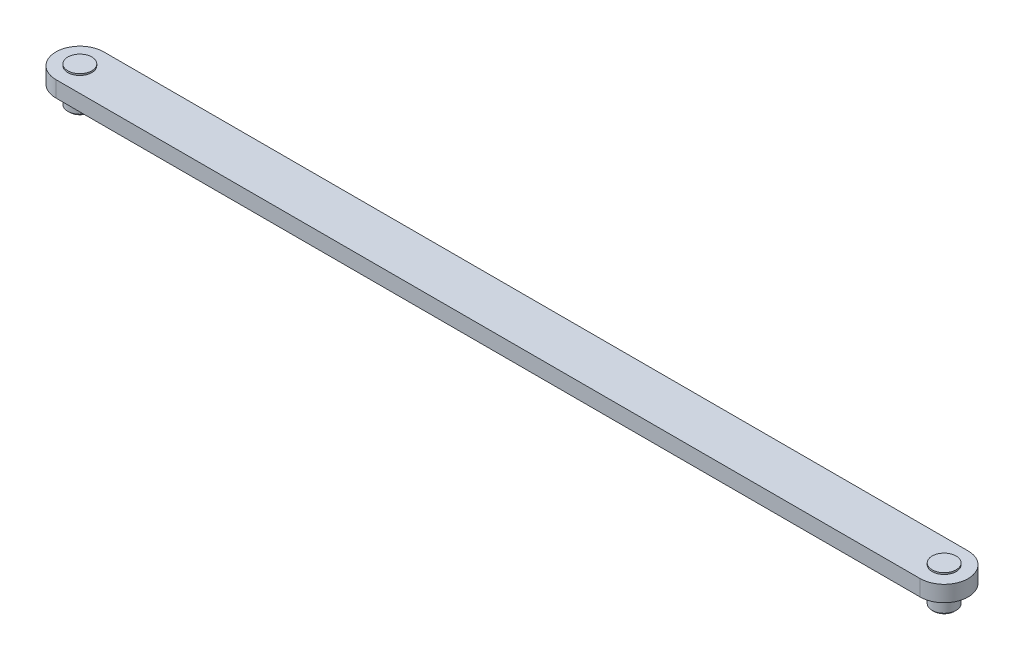
ISO-10303-21;
HEADER;
FILE_DESCRIPTION(('STEP AP214'),'2;1');
FILE_NAME('part.step','',(''),(''),'','','');
FILE_SCHEMA(('AUTOMOTIVE_DESIGN { 1 0 10303 214 1 1 1 1 }'));
ENDSEC;
DATA;
#1=APPLICATION_CONTEXT('core data for automotive mechanical design processes');
#2=APPLICATION_PROTOCOL_DEFINITION('international standard','automotive_design',2000,#1);
#3=PRODUCT_CONTEXT('',#1,'mechanical');
#4=PRODUCT('Part','Part','',(#3));
#5=PRODUCT_RELATED_PRODUCT_CATEGORY('part','',(#4));
#6=PRODUCT_DEFINITION_FORMATION('','',#4);
#7=PRODUCT_DEFINITION_CONTEXT('part definition',#1,'design');
#8=PRODUCT_DEFINITION('design','',#6,#7);
#9=PRODUCT_DEFINITION_SHAPE('','',#8);
#10=(LENGTH_UNIT() NAMED_UNIT(*) SI_UNIT(.MILLI.,.METRE.));
#11=(NAMED_UNIT(*) PLANE_ANGLE_UNIT() SI_UNIT($,.RADIAN.));
#12=(NAMED_UNIT(*) SI_UNIT($,.STERADIAN.) SOLID_ANGLE_UNIT());
#13=UNCERTAINTY_MEASURE_WITH_UNIT(LENGTH_MEASURE(1.E-05),#10,'distance_accuracy_value','');
#14=(GEOMETRIC_REPRESENTATION_CONTEXT(3) GLOBAL_UNCERTAINTY_ASSIGNED_CONTEXT((#13)) GLOBAL_UNIT_ASSIGNED_CONTEXT((#10,
#11,#12)) REPRESENTATION_CONTEXT('',''));
#15=CARTESIAN_POINT('',(0.,0.,0.));
#16=DIRECTION('',(0.,0.,1.));
#17=DIRECTION('',(1.,0.,0.));
#18=AXIS2_PLACEMENT_3D('',#15,#16,#17);
#19=CARTESIAN_POINT('',(-141.647927202037,5.,-139.020874391124));
#20=DIRECTION('',(0.,1.,0.));
#21=DIRECTION('',(0.,0.,1.));
#22=AXIS2_PLACEMENT_3D('',#19,#20,#21);
#23=PLANE('',#22);
#24=CARTESIAN_POINT('',(-141.647927202037,5.,-139.020874391124));
#25=DIRECTION('',(0.,1.,0.));
#26=DIRECTION('',(0.,0.,1.));
#27=AXIS2_PLACEMENT_3D('',#24,#25,#26);
#28=CIRCLE('',#27,7.50000000000001);
#29=CARTESIAN_POINT('',(-141.647927202037,5.,-131.520874391124));
#30=VERTEX_POINT('',#29);
#31=EDGE_CURVE('E112',#30,#30,#28,.T.);
#32=ORIENTED_EDGE('',*,*,#31,.F.);
#33=EDGE_LOOP('',(#32));
#34=FACE_BOUND('',#33,.T.);
#35=CARTESIAN_POINT('',(-141.647927202037,5.,-139.020874391124));
#36=DIRECTION('',(0.,1.,0.));
#37=DIRECTION('',(0.,0.,1.));
#38=AXIS2_PLACEMENT_3D('',#35,#36,#37);
#39=CIRCLE('',#38,15.);
#40=CARTESIAN_POINT('',(-141.647927202037,5.,-154.020874391124));
#41=VERTEX_POINT('',#40);
#42=CARTESIAN_POINT('',(-141.647927202037,5.,-124.020874391124));
#43=VERTEX_POINT('',#42);
#44=EDGE_CURVE('E94',#41,#43,#39,.T.);
#45=ORIENTED_EDGE('',*,*,#44,.T.);
#46=DIRECTION('',(1.,0.,0.));
#47=VECTOR('',#46,1.);
#48=CARTESIAN_POINT('',(-141.647927202037,5.,-124.020874391124));
#49=LINE('',#48,#47);
#50=CARTESIAN_POINT('',(399.122072797963,5.,-124.020874391124));
#51=VERTEX_POINT('',#50);
#52=EDGE_CURVE('E89',#43,#51,#49,.T.);
#53=ORIENTED_EDGE('',*,*,#52,.T.);
#54=CARTESIAN_POINT('',(399.122072797963,5.,-139.020874391124));
#55=DIRECTION('',(0.,1.,0.));
#56=DIRECTION('',(0.,0.,1.));
#57=AXIS2_PLACEMENT_3D('',#54,#55,#56);
#58=CIRCLE('',#57,15.);
#59=CARTESIAN_POINT('',(399.122072797963,5.,-154.020874391124));
#60=VERTEX_POINT('',#59);
#61=EDGE_CURVE('E92',#51,#60,#58,.T.);
#62=ORIENTED_EDGE('',*,*,#61,.T.);
#63=DIRECTION('',(-1.,0.,0.));
#64=VECTOR('',#63,1.);
#65=CARTESIAN_POINT('',(-141.647927202037,5.,-154.020874391124));
#66=LINE('',#65,#64);
#67=EDGE_CURVE('E58',#60,#41,#66,.T.);
#68=ORIENTED_EDGE('',*,*,#67,.T.);
#69=EDGE_LOOP('',(#45,#53,#62,#68));
#70=FACE_BOUND('',#69,.T.);
#71=CARTESIAN_POINT('',(399.122072797963,5.,-139.020874391124));
#72=DIRECTION('',(0.,1.,0.));
#73=DIRECTION('',(0.,0.,1.));
#74=AXIS2_PLACEMENT_3D('',#71,#72,#73);
#75=CIRCLE('',#74,7.50000000000001);
#76=CARTESIAN_POINT('',(399.122072797963,5.,-131.520874391124));
#77=VERTEX_POINT('',#76);
#78=EDGE_CURVE('E200',#77,#77,#75,.T.);
#79=ORIENTED_EDGE('',*,*,#78,.F.);
#80=EDGE_LOOP('',(#79));
#81=FACE_BOUND('',#80,.T.);
#82=ADVANCED_FACE('F40',(#34,#70,#81),#23,.T.);
#83=CARTESIAN_POINT('',(-141.647927202037,-5.,-139.020874391124));
#84=DIRECTION('',(0.,1.,0.));
#85=DIRECTION('',(0.,0.,1.));
#86=AXIS2_PLACEMENT_3D('',#83,#84,#85);
#87=PLANE('',#86);
#88=CARTESIAN_POINT('',(-141.647927202037,-5.,-139.020874391124));
#89=DIRECTION('',(0.,1.,0.));
#90=DIRECTION('',(0.,0.,1.));
#91=AXIS2_PLACEMENT_3D('',#88,#89,#90);
#92=CIRCLE('',#91,15.);
#93=CARTESIAN_POINT('',(-141.647927202037,-5.,-154.020874391124));
#94=VERTEX_POINT('',#93);
#95=CARTESIAN_POINT('',(-141.647927202037,-5.,-124.020874391124));
#96=VERTEX_POINT('',#95);
#97=EDGE_CURVE('E109',#94,#96,#92,.T.);
#98=ORIENTED_EDGE('',*,*,#97,.F.);
#99=DIRECTION('',(-1.,0.,0.));
#100=VECTOR('',#99,1.);
#101=CARTESIAN_POINT('',(-141.647927202037,-5.,-154.020874391124));
#102=LINE('',#101,#100);
#103=CARTESIAN_POINT('',(399.122072797963,-5.,-154.020874391124));
#104=VERTEX_POINT('',#103);
#105=EDGE_CURVE('E81',#104,#94,#102,.T.);
#106=ORIENTED_EDGE('',*,*,#105,.F.);
#107=CARTESIAN_POINT('',(399.122072797963,-5.,-139.020874391124));
#108=DIRECTION('',(0.,1.,0.));
#109=DIRECTION('',(0.,0.,1.));
#110=AXIS2_PLACEMENT_3D('',#107,#108,#109);
#111=CIRCLE('',#110,15.);
#112=CARTESIAN_POINT('',(399.122072797963,-5.,-124.020874391124));
#113=VERTEX_POINT('',#112);
#114=EDGE_CURVE('E75',#113,#104,#111,.T.);
#115=ORIENTED_EDGE('',*,*,#114,.F.);
#116=DIRECTION('',(1.,0.,0.));
#117=VECTOR('',#116,1.);
#118=CARTESIAN_POINT('',(-141.647927202037,-5.,-124.020874391124));
#119=LINE('',#118,#117);
#120=EDGE_CURVE('E99',#96,#113,#119,.T.);
#121=ORIENTED_EDGE('',*,*,#120,.F.);
#122=EDGE_LOOP('',(#98,#106,#115,#121));
#123=FACE_BOUND('',#122,.T.);
#124=CARTESIAN_POINT('',(-141.647927202037,-5.,-139.020874391124));
#125=DIRECTION('',(0.,1.,0.));
#126=DIRECTION('',(0.,0.,1.));
#127=AXIS2_PLACEMENT_3D('',#124,#125,#126);
#128=CIRCLE('',#127,7.50000000000001);
#129=CARTESIAN_POINT('',(-141.647927202037,-5.,-131.520874391124));
#130=VERTEX_POINT('',#129);
#131=EDGE_CURVE('E212',#130,#130,#128,.F.);
#132=ORIENTED_EDGE('',*,*,#131,.F.);
#133=EDGE_LOOP('',(#132));
#134=FACE_BOUND('',#133,.T.);
#135=CARTESIAN_POINT('',(399.122072797963,-5.,-139.020874391124));
#136=DIRECTION('',(0.,1.,0.));
#137=DIRECTION('',(0.,0.,1.));
#138=AXIS2_PLACEMENT_3D('',#135,#136,#137);
#139=CIRCLE('',#138,7.49999999999996);
#140=CARTESIAN_POINT('',(399.122072797963,-5.,-131.520874391124));
#141=VERTEX_POINT('',#140);
#142=EDGE_CURVE('E204',#141,#141,#139,.T.);
#143=ORIENTED_EDGE('',*,*,#142,.T.);
#144=EDGE_LOOP('',(#143));
#145=FACE_BOUND('',#144,.T.);
#146=ADVANCED_FACE('F141',(#123,#134,#145),#87,.F.);
#147=CARTESIAN_POINT('',(-141.647927202037,5.,-139.020874391124));
#148=DIRECTION('',(0.,-1.,0.));
#149=DIRECTION('',(0.,0.,-1.));
#150=AXIS2_PLACEMENT_3D('',#147,#148,#149);
#151=CYLINDRICAL_SURFACE('',#150,15.);
#152=ORIENTED_EDGE('',*,*,#97,.T.);
#153=DIRECTION('',(0.,-1.,0.));
#154=VECTOR('',#153,1.);
#155=CARTESIAN_POINT('',(-141.647927202037,5.,-124.020874391124));
#156=LINE('',#155,#154);
#157=EDGE_CURVE('E100',#43,#96,#156,.T.);
#158=ORIENTED_EDGE('',*,*,#157,.F.);
#159=ORIENTED_EDGE('',*,*,#44,.F.);
#160=DIRECTION('',(0.,-1.,0.));
#161=VECTOR('',#160,1.);
#162=CARTESIAN_POINT('',(-141.647927202037,5.,-154.020874391124));
#163=LINE('',#162,#161);
#164=EDGE_CURVE('E105',#41,#94,#163,.T.);
#165=ORIENTED_EDGE('',*,*,#164,.T.);
#166=EDGE_LOOP('',(#152,#158,#159,#165));
#167=FACE_BOUND('',#166,.T.);
#168=ADVANCED_FACE('F147',(#167),#151,.T.);
#169=CARTESIAN_POINT('',(-141.647927202037,5.,-124.020874391124));
#170=DIRECTION('',(0.,0.,-1.));
#171=DIRECTION('',(-1.,0.,0.));
#172=AXIS2_PLACEMENT_3D('',#169,#170,#171);
#173=PLANE('',#172);
#174=ORIENTED_EDGE('',*,*,#120,.T.);
#175=DIRECTION('',(0.,-1.,0.));
#176=VECTOR('',#175,1.);
#177=CARTESIAN_POINT('',(399.122072797963,5.,-124.020874391124));
#178=LINE('',#177,#176);
#179=EDGE_CURVE('E97',#51,#113,#178,.T.);
#180=ORIENTED_EDGE('',*,*,#179,.F.);
#181=ORIENTED_EDGE('',*,*,#52,.F.);
#182=ORIENTED_EDGE('',*,*,#157,.T.);
#183=EDGE_LOOP('',(#174,#180,#181,#182));
#184=FACE_BOUND('',#183,.T.);
#185=ADVANCED_FACE('F98',(#184),#173,.F.);
#186=CARTESIAN_POINT('',(399.122072797963,5.,-139.020874391124));
#187=DIRECTION('',(0.,-1.,0.));
#188=DIRECTION('',(0.,0.,-1.));
#189=AXIS2_PLACEMENT_3D('',#186,#187,#188);
#190=CYLINDRICAL_SURFACE('',#189,15.);
#191=ORIENTED_EDGE('',*,*,#114,.T.);
#192=DIRECTION('',(0.,-1.,0.));
#193=VECTOR('',#192,1.);
#194=CARTESIAN_POINT('',(399.122072797963,5.,-154.020874391124));
#195=LINE('',#194,#193);
#196=EDGE_CURVE('E101',#60,#104,#195,.T.);
#197=ORIENTED_EDGE('',*,*,#196,.F.);
#198=ORIENTED_EDGE('',*,*,#61,.F.);
#199=ORIENTED_EDGE('',*,*,#179,.T.);
#200=EDGE_LOOP('',(#191,#197,#198,#199));
#201=FACE_BOUND('',#200,.T.);
#202=ADVANCED_FACE('F103',(#201),#190,.T.);
#203=CARTESIAN_POINT('',(-141.647927202037,5.,-154.020874391124));
#204=DIRECTION('',(0.,0.,1.));
#205=DIRECTION('',(1.,0.,0.));
#206=AXIS2_PLACEMENT_3D('',#203,#204,#205);
#207=PLANE('',#206);
#208=ORIENTED_EDGE('',*,*,#105,.T.);
#209=ORIENTED_EDGE('',*,*,#164,.F.);
#210=ORIENTED_EDGE('',*,*,#67,.F.);
#211=ORIENTED_EDGE('',*,*,#196,.T.);
#212=EDGE_LOOP('',(#208,#209,#210,#211));
#213=FACE_BOUND('',#212,.T.);
#214=ADVANCED_FACE('F155',(#213),#207,.F.);
#215=CARTESIAN_POINT('',(0.,-17.,0.));
#216=DIRECTION('',(0.,1.,0.));
#217=DIRECTION('',(0.,0.,1.));
#218=AXIS2_PLACEMENT_3D('',#215,#216,#217);
#219=PLANE('',#218);
#220=CARTESIAN_POINT('',(-141.647927202037,-17.,-139.020874391124));
#221=DIRECTION('',(0.,1.,0.));
#222=DIRECTION('',(0.,0.,1.));
#223=AXIS2_PLACEMENT_3D('',#220,#221,#222);
#224=CIRCLE('',#223,6.49999999999995);
#225=CARTESIAN_POINT('',(-141.647927202037,-17.,-132.520874391124));
#226=VERTEX_POINT('',#225);
#227=EDGE_CURVE('E119',#226,#226,#224,.F.);
#228=ORIENTED_EDGE('',*,*,#227,.T.);
#229=EDGE_LOOP('',(#228));
#230=FACE_BOUND('',#229,.T.);
#231=ADVANCED_FACE('F158',(#230),#219,.F.);
#232=CARTESIAN_POINT('',(-141.647927202037,-17.,-139.020874391124));
#233=DIRECTION('',(0.,1.,0.));
#234=DIRECTION('',(0.,0.,1.));
#235=AXIS2_PLACEMENT_3D('',#232,#233,#234);
#236=CYLINDRICAL_SURFACE('',#235,7.50000000000001);
#237=CARTESIAN_POINT('',(-141.647927202037,-15.9999999999999,-139.020874391124));
#238=DIRECTION('',(0.,1.,0.));
#239=DIRECTION('',(0.,0.,1.));
#240=AXIS2_PLACEMENT_3D('',#237,#238,#239);
#241=CIRCLE('',#240,7.50000000000001);
#242=CARTESIAN_POINT('',(-141.647927202037,-15.9999999999999,-131.520874391124));
#243=VERTEX_POINT('',#242);
#244=EDGE_CURVE('E122',#243,#243,#241,.T.);
#245=ORIENTED_EDGE('',*,*,#244,.T.);
#246=EDGE_LOOP('',(#245));
#247=FACE_BOUND('',#246,.T.);
#248=ORIENTED_EDGE('',*,*,#131,.T.);
#249=EDGE_LOOP('',(#248));
#250=FACE_BOUND('',#249,.T.);
#251=ADVANCED_FACE('F186',(#247,#250),#236,.T.);
#252=ORIENTED_EDGE('',*,*,#31,.T.);
#253=EDGE_LOOP('',(#252));
#254=FACE_BOUND('',#253,.T.);
#255=CARTESIAN_POINT('',(-141.647927202037,6.,-139.020874391124));
#256=DIRECTION('',(0.,1.,0.));
#257=DIRECTION('',(0.,0.,1.));
#258=AXIS2_PLACEMENT_3D('',#255,#256,#257);
#259=CIRCLE('',#258,7.50000000000001);
#260=CARTESIAN_POINT('',(-141.647927202037,6.,-131.520874391124));
#261=VERTEX_POINT('',#260);
#262=EDGE_CURVE('E207',#261,#261,#259,.F.);
#263=ORIENTED_EDGE('',*,*,#262,.T.);
#264=EDGE_LOOP('',(#263));
#265=FACE_BOUND('',#264,.T.);
#266=ADVANCED_FACE('F152',(#254,#265),#236,.T.);
#267=CARTESIAN_POINT('',(0.,6.,0.));
#268=DIRECTION('',(0.,1.,0.));
#269=DIRECTION('',(0.,0.,1.));
#270=AXIS2_PLACEMENT_3D('',#267,#268,#269);
#271=PLANE('',#270);
#272=ORIENTED_EDGE('',*,*,#262,.F.);
#273=EDGE_LOOP('',(#272));
#274=FACE_BOUND('',#273,.T.);
#275=ADVANCED_FACE('F171',(#274),#271,.T.);
#276=CARTESIAN_POINT('',(-141.647927202037,-17.,-139.020874391124));
#277=DIRECTION('',(0.,1.,0.));
#278=DIRECTION('',(0.,0.,1.));
#279=AXIS2_PLACEMENT_3D('',#276,#277,#278);
#280=CONICAL_SURFACE('',#279,6.49999999999995,0.785398163397435);
#281=ORIENTED_EDGE('',*,*,#244,.F.);
#282=EDGE_LOOP('',(#281));
#283=FACE_BOUND('',#282,.T.);
#284=ORIENTED_EDGE('',*,*,#227,.F.);
#285=EDGE_LOOP('',(#284));
#286=FACE_BOUND('',#285,.T.);
#287=ADVANCED_FACE('F166',(#283,#286),#280,.T.);
#288=CARTESIAN_POINT('',(399.122072797963,-17.,-139.020874391124));
#289=DIRECTION('',(0.,1.,0.));
#290=DIRECTION('',(0.,0.,1.));
#291=AXIS2_PLACEMENT_3D('',#288,#289,#290);
#292=PLANE('',#291);
#293=CARTESIAN_POINT('',(399.122072797963,-17.,-139.020874391124));
#294=DIRECTION('',(0.,1.,0.));
#295=DIRECTION('',(0.,0.,1.));
#296=AXIS2_PLACEMENT_3D('',#293,#294,#295);
#297=CIRCLE('',#296,6.49999999999984);
#298=CARTESIAN_POINT('',(399.122072797963,-17.,-132.520874391124));
#299=VERTEX_POINT('',#298);
#300=EDGE_CURVE('E11',#299,#299,#297,.F.);
#301=ORIENTED_EDGE('',*,*,#300,.T.);
#302=EDGE_LOOP('',(#301));
#303=FACE_BOUND('',#302,.T.);
#304=ADVANCED_FACE('F170',(#303),#292,.F.);
#305=CARTESIAN_POINT('',(399.122072797963,-17.,-139.020874391124));
#306=DIRECTION('',(0.,1.,0.));
#307=DIRECTION('',(0.,0.,1.));
#308=AXIS2_PLACEMENT_3D('',#305,#306,#307);
#309=CYLINDRICAL_SURFACE('',#308,7.49999999999996);
#310=CARTESIAN_POINT('',(399.122072797963,-15.9999999999999,-139.020874391124));
#311=DIRECTION('',(0.,1.,0.));
#312=DIRECTION('',(0.,0.,1.));
#313=AXIS2_PLACEMENT_3D('',#310,#311,#312);
#314=CIRCLE('',#313,7.49999999999996);
#315=CARTESIAN_POINT('',(399.122072797963,-15.9999999999999,-131.520874391124));
#316=VERTEX_POINT('',#315);
#317=EDGE_CURVE('E50',#316,#316,#314,.T.);
#318=ORIENTED_EDGE('',*,*,#317,.T.);
#319=EDGE_LOOP('',(#318));
#320=FACE_BOUND('',#319,.T.);
#321=ORIENTED_EDGE('',*,*,#142,.F.);
#322=EDGE_LOOP('',(#321));
#323=FACE_BOUND('',#322,.T.);
#324=ADVANCED_FACE('F127',(#320,#323),#309,.T.);
#325=ORIENTED_EDGE('',*,*,#78,.T.);
#326=EDGE_LOOP('',(#325));
#327=FACE_BOUND('',#326,.T.);
#328=CARTESIAN_POINT('',(399.122072797963,6.,-139.020874391124));
#329=DIRECTION('',(0.,1.,0.));
#330=DIRECTION('',(0.,0.,1.));
#331=AXIS2_PLACEMENT_3D('',#328,#329,#330);
#332=CIRCLE('',#331,7.49999999999996);
#333=CARTESIAN_POINT('',(399.122072797963,6.,-131.520874391124));
#334=VERTEX_POINT('',#333);
#335=EDGE_CURVE('E203',#334,#334,#332,.T.);
#336=ORIENTED_EDGE('',*,*,#335,.F.);
#337=EDGE_LOOP('',(#336));
#338=FACE_BOUND('',#337,.T.);
#339=ADVANCED_FACE('F136',(#327,#338),#309,.T.);
#340=CARTESIAN_POINT('',(399.122072797963,6.,-139.020874391124));
#341=DIRECTION('',(0.,1.,0.));
#342=DIRECTION('',(0.,0.,1.));
#343=AXIS2_PLACEMENT_3D('',#340,#341,#342);
#344=PLANE('',#343);
#345=ORIENTED_EDGE('',*,*,#335,.T.);
#346=EDGE_LOOP('',(#345));
#347=FACE_BOUND('',#346,.T.);
#348=ADVANCED_FACE('F131',(#347),#344,.T.);
#349=CARTESIAN_POINT('',(399.122072797963,-15.9999999999999,-139.020874391124));
#350=DIRECTION('',(0.,1.,0.));
#351=DIRECTION('',(0.,0.,1.));
#352=AXIS2_PLACEMENT_3D('',#349,#350,#351);
#353=CONICAL_SURFACE('',#352,7.49999999999996,0.78539816339746);
#354=ORIENTED_EDGE('',*,*,#300,.F.);
#355=EDGE_LOOP('',(#354));
#356=FACE_BOUND('',#355,.T.);
#357=ORIENTED_EDGE('',*,*,#317,.F.);
#358=EDGE_LOOP('',(#357));
#359=FACE_BOUND('',#358,.T.);
#360=ADVANCED_FACE('F43',(#356,#359),#353,.T.);
#361=CLOSED_SHELL('',(#82,#146,#168,#185,#202,#214,#231,#251,#266,#275,#287,#304,#324,#339,#348,#360));
#362=MANIFOLD_SOLID_BREP('B2',#361);
#363=ADVANCED_BREP_SHAPE_REPRESENTATION('',(#18,#362),#14);
#364=SHAPE_DEFINITION_REPRESENTATION(#9,#363);
ENDSEC;
END-ISO-10303-21;
